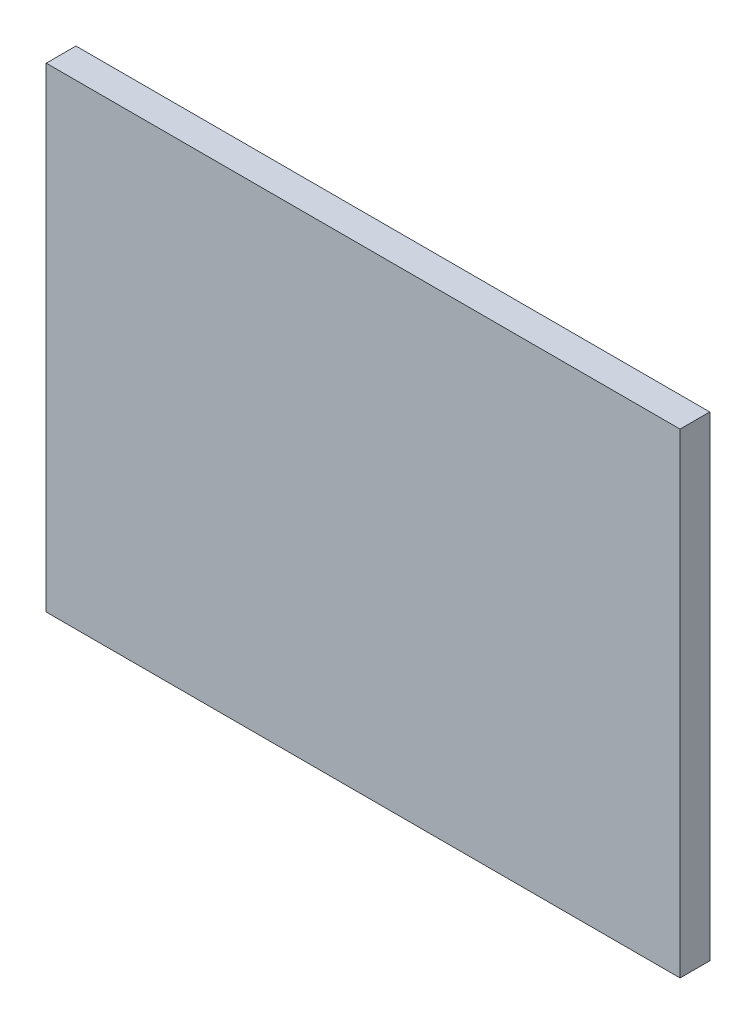
ISO-10303-21;
HEADER;
FILE_DESCRIPTION(('STEP AP214'),'2;1');
FILE_NAME('part.step','',(''),(''),'','','');
FILE_SCHEMA(('AUTOMOTIVE_DESIGN { 1 0 10303 214 1 1 1 1 }'));
ENDSEC;
DATA;
#1=APPLICATION_CONTEXT('core data for automotive mechanical design processes');
#2=APPLICATION_PROTOCOL_DEFINITION('international standard','automotive_design',2000,#1);
#3=PRODUCT_CONTEXT('',#1,'mechanical');
#4=PRODUCT('Part','Part','',(#3));
#5=PRODUCT_RELATED_PRODUCT_CATEGORY('part','',(#4));
#6=PRODUCT_DEFINITION_FORMATION('','',#4);
#7=PRODUCT_DEFINITION_CONTEXT('part definition',#1,'design');
#8=PRODUCT_DEFINITION('design','',#6,#7);
#9=PRODUCT_DEFINITION_SHAPE('','',#8);
#10=(LENGTH_UNIT() NAMED_UNIT(*) SI_UNIT(.MILLI.,.METRE.));
#11=(NAMED_UNIT(*) PLANE_ANGLE_UNIT() SI_UNIT($,.RADIAN.));
#12=(NAMED_UNIT(*) SI_UNIT($,.STERADIAN.) SOLID_ANGLE_UNIT());
#13=UNCERTAINTY_MEASURE_WITH_UNIT(LENGTH_MEASURE(1.E-05),#10,'distance_accuracy_value','');
#14=(GEOMETRIC_REPRESENTATION_CONTEXT(3) GLOBAL_UNCERTAINTY_ASSIGNED_CONTEXT((#13)) GLOBAL_UNIT_ASSIGNED_CONTEXT((#10,
#11,#12)) REPRESENTATION_CONTEXT('',''));
#15=CARTESIAN_POINT('',(0.,0.,0.));
#16=DIRECTION('',(0.,0.,1.));
#17=DIRECTION('',(1.,0.,0.));
#18=AXIS2_PLACEMENT_3D('',#15,#16,#17);
#19=CARTESIAN_POINT('',(-100.400410677618,-228.208829568789,19.05));
#20=DIRECTION('',(1.,0.,0.));
#21=DIRECTION('',(0.,0.,-1.));
#22=AXIS2_PLACEMENT_3D('',#19,#20,#21);
#23=PLANE('',#22);
#24=DIRECTION('',(0.,-1.,0.));
#25=VECTOR('',#24,1.);
#26=CARTESIAN_POINT('',(-100.400410677618,-228.208829568789,0.));
#27=LINE('',#26,#25);
#28=CARTESIAN_POINT('',(-100.400410677618,76.5911704312115,0.));
#29=VERTEX_POINT('',#28);
#30=CARTESIAN_POINT('',(-100.400410677618,-228.208829568789,0.));
#31=VERTEX_POINT('',#30);
#32=EDGE_CURVE('E100',#29,#31,#27,.T.);
#33=ORIENTED_EDGE('',*,*,#32,.T.);
#34=DIRECTION('',(0.,0.,-1.));
#35=VECTOR('',#34,1.);
#36=CARTESIAN_POINT('',(-100.400410677618,-228.208829568789,19.05));
#37=LINE('',#36,#35);
#38=CARTESIAN_POINT('',(-100.400410677618,-228.208829568789,19.05));
#39=VERTEX_POINT('',#38);
#40=EDGE_CURVE('E11',#39,#31,#37,.T.);
#41=ORIENTED_EDGE('',*,*,#40,.F.);
#42=DIRECTION('',(0.,-1.,0.));
#43=VECTOR('',#42,1.);
#44=CARTESIAN_POINT('',(-100.400410677618,-228.208829568789,19.05));
#45=LINE('',#44,#43);
#46=CARTESIAN_POINT('',(-100.400410677618,76.5911704312115,19.05));
#47=VERTEX_POINT('',#46);
#48=EDGE_CURVE('E88',#47,#39,#45,.T.);
#49=ORIENTED_EDGE('',*,*,#48,.F.);
#50=DIRECTION('',(0.,0.,-1.));
#51=VECTOR('',#50,1.);
#52=CARTESIAN_POINT('',(-100.400410677618,76.5911704312115,19.05));
#53=LINE('',#52,#51);
#54=EDGE_CURVE('E96',#47,#29,#53,.T.);
#55=ORIENTED_EDGE('',*,*,#54,.T.);
#56=EDGE_LOOP('',(#33,#41,#49,#55));
#57=FACE_BOUND('',#56,.T.);
#58=ADVANCED_FACE('F37',(#57),#23,.F.);
#59=CARTESIAN_POINT('',(-100.400410677618,-228.208829568789,19.05));
#60=DIRECTION('',(0.,1.,0.));
#61=DIRECTION('',(0.,0.,1.));
#62=AXIS2_PLACEMENT_3D('',#59,#60,#61);
#63=PLANE('',#62);
#64=DIRECTION('',(1.,0.,0.));
#65=VECTOR('',#64,1.);
#66=CARTESIAN_POINT('',(-100.400410677618,-228.208829568789,0.));
#67=LINE('',#66,#65);
#68=CARTESIAN_POINT('',(305.999589322382,-228.208829568789,0.));
#69=VERTEX_POINT('',#68);
#70=EDGE_CURVE('E92',#31,#69,#67,.T.);
#71=ORIENTED_EDGE('',*,*,#70,.T.);
#72=DIRECTION('',(0.,0.,-1.));
#73=VECTOR('',#72,1.);
#74=CARTESIAN_POINT('',(305.999589322382,-228.208829568789,19.05));
#75=LINE('',#74,#73);
#76=CARTESIAN_POINT('',(305.999589322382,-228.208829568789,19.05));
#77=VERTEX_POINT('',#76);
#78=EDGE_CURVE('E45',#77,#69,#75,.T.);
#79=ORIENTED_EDGE('',*,*,#78,.F.);
#80=DIRECTION('',(1.,0.,0.));
#81=VECTOR('',#80,1.);
#82=CARTESIAN_POINT('',(-100.400410677618,-228.208829568789,19.05));
#83=LINE('',#82,#81);
#84=EDGE_CURVE('E83',#39,#77,#83,.T.);
#85=ORIENTED_EDGE('',*,*,#84,.F.);
#86=ORIENTED_EDGE('',*,*,#40,.T.);
#87=EDGE_LOOP('',(#71,#79,#85,#86));
#88=FACE_BOUND('',#87,.T.);
#89=ADVANCED_FACE('F91',(#88),#63,.F.);
#90=CARTESIAN_POINT('',(305.999589322382,-228.208829568789,19.05));
#91=DIRECTION('',(-1.,0.,0.));
#92=DIRECTION('',(0.,0.,1.));
#93=AXIS2_PLACEMENT_3D('',#90,#91,#92);
#94=PLANE('',#93);
#95=DIRECTION('',(0.,1.,0.));
#96=VECTOR('',#95,1.);
#97=CARTESIAN_POINT('',(305.999589322382,-228.208829568789,0.));
#98=LINE('',#97,#96);
#99=CARTESIAN_POINT('',(305.999589322382,76.5911704312115,0.));
#100=VERTEX_POINT('',#99);
#101=EDGE_CURVE('E70',#69,#100,#98,.T.);
#102=ORIENTED_EDGE('',*,*,#101,.T.);
#103=DIRECTION('',(0.,0.,-1.));
#104=VECTOR('',#103,1.);
#105=CARTESIAN_POINT('',(305.999589322382,76.5911704312115,19.05));
#106=LINE('',#105,#104);
#107=CARTESIAN_POINT('',(305.999589322382,76.5911704312115,19.05));
#108=VERTEX_POINT('',#107);
#109=EDGE_CURVE('E93',#108,#100,#106,.T.);
#110=ORIENTED_EDGE('',*,*,#109,.F.);
#111=DIRECTION('',(0.,1.,0.));
#112=VECTOR('',#111,1.);
#113=CARTESIAN_POINT('',(305.999589322382,-228.208829568789,19.05));
#114=LINE('',#113,#112);
#115=EDGE_CURVE('E86',#77,#108,#114,.T.);
#116=ORIENTED_EDGE('',*,*,#115,.F.);
#117=ORIENTED_EDGE('',*,*,#78,.T.);
#118=EDGE_LOOP('',(#102,#110,#116,#117));
#119=FACE_BOUND('',#118,.T.);
#120=ADVANCED_FACE('F94',(#119),#94,.F.);
#121=CARTESIAN_POINT('',(-100.400410677618,76.5911704312115,19.05));
#122=DIRECTION('',(0.,-1.,0.));
#123=DIRECTION('',(0.,0.,-1.));
#124=AXIS2_PLACEMENT_3D('',#121,#122,#123);
#125=PLANE('',#124);
#126=DIRECTION('',(-1.,0.,0.));
#127=VECTOR('',#126,1.);
#128=CARTESIAN_POINT('',(-100.400410677618,76.5911704312115,0.));
#129=LINE('',#128,#127);
#130=EDGE_CURVE('E76',#100,#29,#129,.T.);
#131=ORIENTED_EDGE('',*,*,#130,.T.);
#132=ORIENTED_EDGE('',*,*,#54,.F.);
#133=DIRECTION('',(-1.,0.,0.));
#134=VECTOR('',#133,1.);
#135=CARTESIAN_POINT('',(-100.400410677618,76.5911704312115,19.05));
#136=LINE('',#135,#134);
#137=EDGE_CURVE('E53',#108,#47,#136,.T.);
#138=ORIENTED_EDGE('',*,*,#137,.F.);
#139=ORIENTED_EDGE('',*,*,#109,.T.);
#140=EDGE_LOOP('',(#131,#132,#138,#139));
#141=FACE_BOUND('',#140,.T.);
#142=ADVANCED_FACE('F107',(#141),#125,.F.);
#143=CARTESIAN_POINT('',(-100.400410677618,76.5911704312115,19.05));
#144=DIRECTION('',(0.,0.,-1.));
#145=DIRECTION('',(-1.,0.,0.));
#146=AXIS2_PLACEMENT_3D('',#143,#144,#145);
#147=PLANE('',#146);
#148=ORIENTED_EDGE('',*,*,#48,.T.);
#149=ORIENTED_EDGE('',*,*,#84,.T.);
#150=ORIENTED_EDGE('',*,*,#115,.T.);
#151=ORIENTED_EDGE('',*,*,#137,.T.);
#152=EDGE_LOOP('',(#148,#149,#150,#151));
#153=FACE_BOUND('',#152,.T.);
#154=ADVANCED_FACE('F84',(#153),#147,.F.);
#155=CARTESIAN_POINT('',(-100.400410677618,76.5911704312115,0.));
#156=DIRECTION('',(0.,0.,-1.));
#157=DIRECTION('',(-1.,0.,0.));
#158=AXIS2_PLACEMENT_3D('',#155,#156,#157);
#159=PLANE('',#158);
#160=ORIENTED_EDGE('',*,*,#32,.F.);
#161=ORIENTED_EDGE('',*,*,#130,.F.);
#162=ORIENTED_EDGE('',*,*,#101,.F.);
#163=ORIENTED_EDGE('',*,*,#70,.F.);
#164=EDGE_LOOP('',(#160,#161,#162,#163));
#165=FACE_BOUND('',#164,.T.);
#166=ADVANCED_FACE('F110',(#165),#159,.T.);
#167=CLOSED_SHELL('',(#58,#89,#120,#142,#154,#166));
#168=MANIFOLD_SOLID_BREP('B2',#167);
#169=ADVANCED_BREP_SHAPE_REPRESENTATION('',(#18,#168),#14);
#170=SHAPE_DEFINITION_REPRESENTATION(#9,#169);
ENDSEC;
END-ISO-10303-21;
